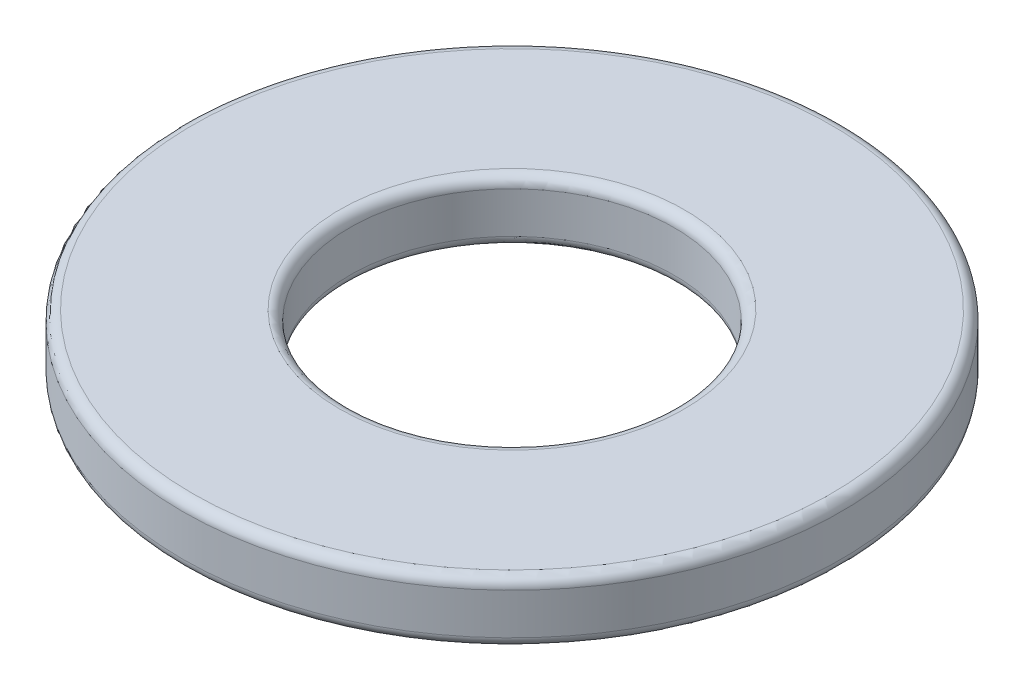
ISO-10303-21;
HEADER;
FILE_DESCRIPTION(('STEP AP214'),'2;1');
FILE_NAME('part.step','',(''),(''),'','','');
FILE_SCHEMA(('AUTOMOTIVE_DESIGN { 1 0 10303 214 1 1 1 1 }'));
ENDSEC;
DATA;
#1=APPLICATION_CONTEXT('core data for automotive mechanical design processes');
#2=APPLICATION_PROTOCOL_DEFINITION('international standard','automotive_design',2000,#1);
#3=PRODUCT_CONTEXT('',#1,'mechanical');
#4=PRODUCT('Part','Part','',(#3));
#5=PRODUCT_RELATED_PRODUCT_CATEGORY('part','',(#4));
#6=PRODUCT_DEFINITION_FORMATION('','',#4);
#7=PRODUCT_DEFINITION_CONTEXT('part definition',#1,'design');
#8=PRODUCT_DEFINITION('design','',#6,#7);
#9=PRODUCT_DEFINITION_SHAPE('','',#8);
#10=(LENGTH_UNIT() NAMED_UNIT(*) SI_UNIT(.MILLI.,.METRE.));
#11=(NAMED_UNIT(*) PLANE_ANGLE_UNIT() SI_UNIT($,.RADIAN.));
#12=(NAMED_UNIT(*) SI_UNIT($,.STERADIAN.) SOLID_ANGLE_UNIT());
#13=UNCERTAINTY_MEASURE_WITH_UNIT(LENGTH_MEASURE(1.E-05),#10,'distance_accuracy_value','');
#14=(GEOMETRIC_REPRESENTATION_CONTEXT(3) GLOBAL_UNCERTAINTY_ASSIGNED_CONTEXT((#13)) GLOBAL_UNIT_ASSIGNED_CONTEXT((#10,
#11,#12)) REPRESENTATION_CONTEXT('',''));
#15=CARTESIAN_POINT('',(0.,0.,0.));
#16=DIRECTION('',(0.,0.,1.));
#17=DIRECTION('',(1.,0.,0.));
#18=AXIS2_PLACEMENT_3D('',#15,#16,#17);
#19=CARTESIAN_POINT('',(0.,1.5,0.));
#20=DIRECTION('',(0.,1.,0.));
#21=DIRECTION('',(0.,0.,1.));
#22=AXIS2_PLACEMENT_3D('',#19,#20,#21);
#23=PLANE('',#22);
#24=CARTESIAN_POINT('',(0.,1.5,0.));
#25=DIRECTION('',(0.,1.,0.));
#26=DIRECTION('',(0.,0.,1.));
#27=AXIS2_PLACEMENT_3D('',#24,#25,#26);
#28=CIRCLE('',#27,8.375);
#29=CARTESIAN_POINT('',(0.,1.5,8.375));
#30=VERTEX_POINT('',#29);
#31=EDGE_CURVE('E10',#30,#30,#28,.F.);
#32=ORIENTED_EDGE('',*,*,#31,.T.);
#33=EDGE_LOOP('',(#32));
#34=FACE_BOUND('',#33,.T.);
#35=CARTESIAN_POINT('',(0.,1.5,0.));
#36=DIRECTION('',(0.,1.,0.));
#37=DIRECTION('',(0.,0.,1.));
#38=AXIS2_PLACEMENT_3D('',#35,#36,#37);
#39=CIRCLE('',#38,15.5);
#40=CARTESIAN_POINT('',(0.,1.5,15.5));
#41=VERTEX_POINT('',#40);
#42=EDGE_CURVE('E38',#41,#41,#39,.T.);
#43=ORIENTED_EDGE('',*,*,#42,.T.);
#44=EDGE_LOOP('',(#43));
#45=FACE_BOUND('',#44,.T.);
#46=ADVANCED_FACE('F31',(#34,#45),#23,.T.);
#47=CARTESIAN_POINT('',(0.,-1.5,0.));
#48=DIRECTION('',(0.,1.,0.));
#49=DIRECTION('',(0.,0.,1.));
#50=AXIS2_PLACEMENT_3D('',#47,#48,#49);
#51=PLANE('',#50);
#52=CARTESIAN_POINT('',(0.,-1.5,0.));
#53=DIRECTION('',(0.,1.,0.));
#54=DIRECTION('',(0.,0.,1.));
#55=AXIS2_PLACEMENT_3D('',#52,#53,#54);
#56=CIRCLE('',#55,8.375);
#57=CARTESIAN_POINT('',(0.,-1.5,8.375));
#58=VERTEX_POINT('',#57);
#59=EDGE_CURVE('E57',#58,#58,#56,.T.);
#60=ORIENTED_EDGE('',*,*,#59,.T.);
#61=EDGE_LOOP('',(#60));
#62=FACE_BOUND('',#61,.T.);
#63=CARTESIAN_POINT('',(0.,-1.5,0.));
#64=DIRECTION('',(0.,1.,0.));
#65=DIRECTION('',(0.,0.,1.));
#66=AXIS2_PLACEMENT_3D('',#63,#64,#65);
#67=CIRCLE('',#66,15.5);
#68=CARTESIAN_POINT('',(0.,-1.5,15.5));
#69=VERTEX_POINT('',#68);
#70=EDGE_CURVE('E60',#69,#69,#67,.F.);
#71=ORIENTED_EDGE('',*,*,#70,.T.);
#72=EDGE_LOOP('',(#71));
#73=FACE_BOUND('',#72,.T.);
#74=ADVANCED_FACE('F64',(#62,#73),#51,.F.);
#75=CARTESIAN_POINT('',(0.,1.5,0.));
#76=DIRECTION('',(0.,-1.,0.));
#77=DIRECTION('',(0.,0.,-1.));
#78=AXIS2_PLACEMENT_3D('',#75,#76,#77);
#79=CYLINDRICAL_SURFACE('',#78,16.);
#80=CARTESIAN_POINT('',(0.,-1.,0.));
#81=DIRECTION('',(0.,1.,0.));
#82=DIRECTION('',(0.,0.,1.));
#83=AXIS2_PLACEMENT_3D('',#80,#81,#82);
#84=CIRCLE('',#83,16.);
#85=CARTESIAN_POINT('',(0.,-1.,16.));
#86=VERTEX_POINT('',#85);
#87=EDGE_CURVE('E42',#86,#86,#84,.T.);
#88=ORIENTED_EDGE('',*,*,#87,.T.);
#89=EDGE_LOOP('',(#88));
#90=FACE_BOUND('',#89,.T.);
#91=CARTESIAN_POINT('',(0.,1.,0.));
#92=DIRECTION('',(0.,1.,0.));
#93=DIRECTION('',(0.,0.,1.));
#94=AXIS2_PLACEMENT_3D('',#91,#92,#93);
#95=CIRCLE('',#94,16.);
#96=CARTESIAN_POINT('',(0.,1.,16.));
#97=VERTEX_POINT('',#96);
#98=EDGE_CURVE('E46',#97,#97,#95,.F.);
#99=ORIENTED_EDGE('',*,*,#98,.T.);
#100=EDGE_LOOP('',(#99));
#101=FACE_BOUND('',#100,.T.);
#102=ADVANCED_FACE('F74',(#90,#101),#79,.T.);
#103=CARTESIAN_POINT('',(0.,1.5,0.));
#104=DIRECTION('',(0.,-1.,0.));
#105=DIRECTION('',(0.,0.,-1.));
#106=AXIS2_PLACEMENT_3D('',#103,#104,#105);
#107=CYLINDRICAL_SURFACE('',#106,7.875);
#108=CARTESIAN_POINT('',(0.,-1.,0.));
#109=DIRECTION('',(0.,1.,0.));
#110=DIRECTION('',(0.,0.,1.));
#111=AXIS2_PLACEMENT_3D('',#108,#109,#110);
#112=CIRCLE('',#111,7.875);
#113=CARTESIAN_POINT('',(0.,-1.,7.875));
#114=VERTEX_POINT('',#113);
#115=EDGE_CURVE('E51',#114,#114,#112,.F.);
#116=ORIENTED_EDGE('',*,*,#115,.T.);
#117=EDGE_LOOP('',(#116));
#118=FACE_BOUND('',#117,.T.);
#119=CARTESIAN_POINT('',(0.,1.,0.));
#120=DIRECTION('',(0.,1.,0.));
#121=DIRECTION('',(0.,0.,1.));
#122=AXIS2_PLACEMENT_3D('',#119,#120,#121);
#123=CIRCLE('',#122,7.875);
#124=CARTESIAN_POINT('',(0.,1.,7.875));
#125=VERTEX_POINT('',#124);
#126=EDGE_CURVE('E54',#125,#125,#123,.T.);
#127=ORIENTED_EDGE('',*,*,#126,.T.);
#128=EDGE_LOOP('',(#127));
#129=FACE_BOUND('',#128,.T.);
#130=ADVANCED_FACE('F77',(#118,#129),#107,.F.);
#131=CARTESIAN_POINT('',(0.,-1.,0.));
#132=DIRECTION('',(0.,1.,0.));
#133=DIRECTION('',(0.,0.,1.));
#134=AXIS2_PLACEMENT_3D('',#131,#132,#133);
#135=TOROIDAL_SURFACE('',#134,8.375,0.5);
#136=ORIENTED_EDGE('',*,*,#115,.F.);
#137=EDGE_LOOP('',(#136));
#138=FACE_BOUND('',#137,.T.);
#139=ORIENTED_EDGE('',*,*,#59,.F.);
#140=EDGE_LOOP('',(#139));
#141=FACE_BOUND('',#140,.T.);
#142=ADVANCED_FACE('F70',(#138,#141),#135,.T.);
#143=CARTESIAN_POINT('',(0.,-1.,0.));
#144=DIRECTION('',(0.,1.,0.));
#145=DIRECTION('',(0.,0.,1.));
#146=AXIS2_PLACEMENT_3D('',#143,#144,#145);
#147=TOROIDAL_SURFACE('',#146,15.5,0.5);
#148=ORIENTED_EDGE('',*,*,#70,.F.);
#149=EDGE_LOOP('',(#148));
#150=FACE_BOUND('',#149,.T.);
#151=ORIENTED_EDGE('',*,*,#87,.F.);
#152=EDGE_LOOP('',(#151));
#153=FACE_BOUND('',#152,.T.);
#154=ADVANCED_FACE('F66',(#150,#153),#147,.T.);
#155=CARTESIAN_POINT('',(0.,1.,0.));
#156=DIRECTION('',(0.,1.,0.));
#157=DIRECTION('',(0.,0.,1.));
#158=AXIS2_PLACEMENT_3D('',#155,#156,#157);
#159=TOROIDAL_SURFACE('',#158,8.375,0.5);
#160=ORIENTED_EDGE('',*,*,#31,.F.);
#161=EDGE_LOOP('',(#160));
#162=FACE_BOUND('',#161,.T.);
#163=ORIENTED_EDGE('',*,*,#126,.F.);
#164=EDGE_LOOP('',(#163));
#165=FACE_BOUND('',#164,.T.);
#166=ADVANCED_FACE('F69',(#162,#165),#159,.T.);
#167=CARTESIAN_POINT('',(0.,1.,0.));
#168=DIRECTION('',(0.,1.,0.));
#169=DIRECTION('',(0.,0.,1.));
#170=AXIS2_PLACEMENT_3D('',#167,#168,#169);
#171=TOROIDAL_SURFACE('',#170,15.5,0.5);
#172=ORIENTED_EDGE('',*,*,#98,.F.);
#173=EDGE_LOOP('',(#172));
#174=FACE_BOUND('',#173,.T.);
#175=ORIENTED_EDGE('',*,*,#42,.F.);
#176=EDGE_LOOP('',(#175));
#177=FACE_BOUND('',#176,.T.);
#178=ADVANCED_FACE('F33',(#174,#177),#171,.T.);
#179=CLOSED_SHELL('',(#46,#74,#102,#130,#142,#154,#166,#178));
#180=MANIFOLD_SOLID_BREP('B2',#179);
#181=ADVANCED_BREP_SHAPE_REPRESENTATION('',(#18,#180),#14);
#182=SHAPE_DEFINITION_REPRESENTATION(#9,#181);
ENDSEC;
END-ISO-10303-21;
